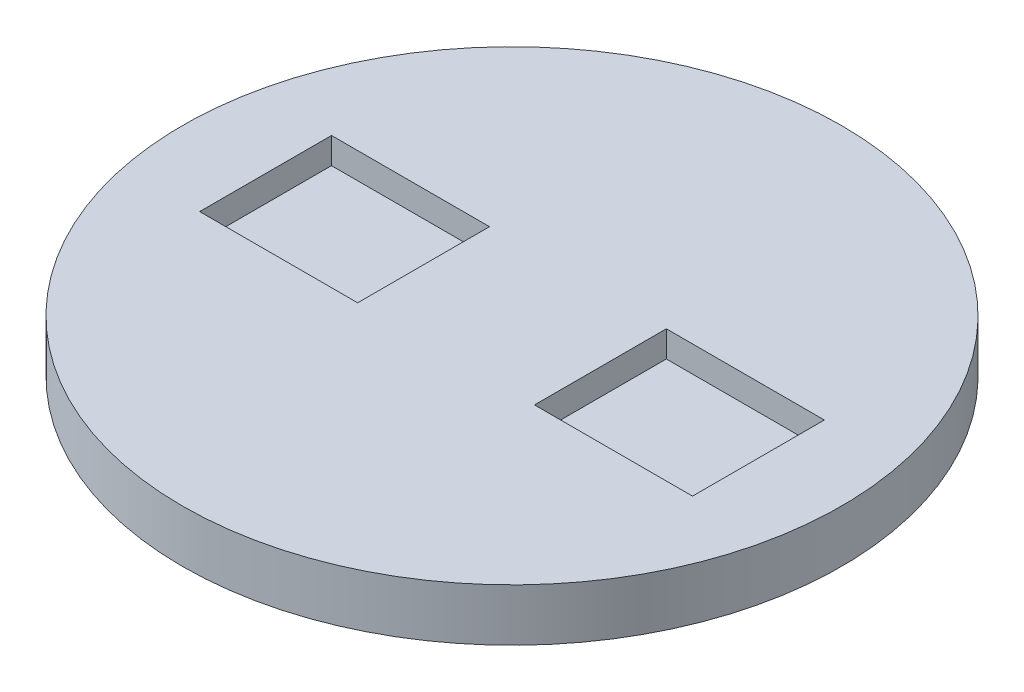
ISO-10303-21;
HEADER;
FILE_DESCRIPTION(('STEP AP214'),'2;1');
FILE_NAME('part.step','',(''),(''),'','','');
FILE_SCHEMA(('AUTOMOTIVE_DESIGN { 1 0 10303 214 1 1 1 1 }'));
ENDSEC;
DATA;
#1=APPLICATION_CONTEXT('core data for automotive mechanical design processes');
#2=APPLICATION_PROTOCOL_DEFINITION('international standard','automotive_design',2000,#1);
#3=PRODUCT_CONTEXT('',#1,'mechanical');
#4=PRODUCT('Part','Part','',(#3));
#5=PRODUCT_RELATED_PRODUCT_CATEGORY('part','',(#4));
#6=PRODUCT_DEFINITION_FORMATION('','',#4);
#7=PRODUCT_DEFINITION_CONTEXT('part definition',#1,'design');
#8=PRODUCT_DEFINITION('design','',#6,#7);
#9=PRODUCT_DEFINITION_SHAPE('','',#8);
#10=(LENGTH_UNIT() NAMED_UNIT(*) SI_UNIT(.MILLI.,.METRE.));
#11=(NAMED_UNIT(*) PLANE_ANGLE_UNIT() SI_UNIT($,.RADIAN.));
#12=(NAMED_UNIT(*) SI_UNIT($,.STERADIAN.) SOLID_ANGLE_UNIT());
#13=UNCERTAINTY_MEASURE_WITH_UNIT(LENGTH_MEASURE(1.E-05),#10,'distance_accuracy_value','');
#14=(GEOMETRIC_REPRESENTATION_CONTEXT(3) GLOBAL_UNCERTAINTY_ASSIGNED_CONTEXT((#13)) GLOBAL_UNIT_ASSIGNED_CONTEXT((#10,
#11,#12)) REPRESENTATION_CONTEXT('',''));
#15=CARTESIAN_POINT('',(0.,0.,0.));
#16=DIRECTION('',(0.,0.,1.));
#17=DIRECTION('',(1.,0.,0.));
#18=AXIS2_PLACEMENT_3D('',#15,#16,#17);
#19=CARTESIAN_POINT('',(0.,10.,0.));
#20=DIRECTION('',(0.,1.,0.));
#21=DIRECTION('',(0.,0.,1.));
#22=AXIS2_PLACEMENT_3D('',#19,#20,#21);
#23=PLANE('',#22);
#24=DIRECTION('',(1.,0.,0.));
#25=VECTOR('',#24,1.);
#26=CARTESIAN_POINT('',(0.,10.,-12.6));
#27=LINE('',#26,#25);
#28=CARTESIAN_POINT('',(-47.1,10.,-12.6));
#29=VERTEX_POINT('',#28);
#30=CARTESIAN_POINT('',(-16.9,10.,-12.6));
#31=VERTEX_POINT('',#30);
#32=EDGE_CURVE('E152',#29,#31,#27,.T.);
#33=ORIENTED_EDGE('',*,*,#32,.T.);
#34=DIRECTION('',(0.,0.,1.));
#35=VECTOR('',#34,1.);
#36=CARTESIAN_POINT('',(-16.9,10.,0.));
#37=LINE('',#36,#35);
#38=CARTESIAN_POINT('',(-16.9,10.,12.6));
#39=VERTEX_POINT('',#38);
#40=EDGE_CURVE('E58',#31,#39,#37,.T.);
#41=ORIENTED_EDGE('',*,*,#40,.T.);
#42=DIRECTION('',(1.,0.,0.));
#43=VECTOR('',#42,1.);
#44=CARTESIAN_POINT('',(0.,10.,12.6));
#45=LINE('',#44,#43);
#46=CARTESIAN_POINT('',(-47.1,10.,12.6));
#47=VERTEX_POINT('',#46);
#48=EDGE_CURVE('E142',#47,#39,#45,.T.);
#49=ORIENTED_EDGE('',*,*,#48,.F.);
#50=DIRECTION('',(0.,0.,1.));
#51=VECTOR('',#50,1.);
#52=CARTESIAN_POINT('',(-47.1,10.,0.));
#53=LINE('',#52,#51);
#54=EDGE_CURVE('E155',#29,#47,#53,.T.);
#55=ORIENTED_EDGE('',*,*,#54,.F.);
#56=EDGE_LOOP('',(#33,#41,#49,#55));
#57=FACE_BOUND('',#56,.T.);
#58=CARTESIAN_POINT('',(0.,10.,0.));
#59=DIRECTION('',(0.,1.,0.));
#60=DIRECTION('',(0.,0.,1.));
#61=AXIS2_PLACEMENT_3D('',#58,#59,#60);
#62=CIRCLE('',#61,62.9894227773488);
#63=CARTESIAN_POINT('',(0.,10.,62.9894227773488));
#64=VERTEX_POINT('',#63);
#65=EDGE_CURVE('E11',#64,#64,#62,.T.);
#66=ORIENTED_EDGE('',*,*,#65,.T.);
#67=EDGE_LOOP('',(#66));
#68=FACE_BOUND('',#67,.T.);
#69=DIRECTION('',(0.,0.,1.));
#70=VECTOR('',#69,1.);
#71=CARTESIAN_POINT('',(16.9,10.,0.));
#72=LINE('',#71,#70);
#73=CARTESIAN_POINT('',(16.9,10.,-12.6));
#74=VERTEX_POINT('',#73);
#75=CARTESIAN_POINT('',(16.9,10.,12.6));
#76=VERTEX_POINT('',#75);
#77=EDGE_CURVE('E127',#74,#76,#72,.T.);
#78=ORIENTED_EDGE('',*,*,#77,.F.);
#79=DIRECTION('',(1.,0.,0.));
#80=VECTOR('',#79,1.);
#81=CARTESIAN_POINT('',(0.,10.,-12.6));
#82=LINE('',#81,#80);
#83=CARTESIAN_POINT('',(47.1,10.,-12.6));
#84=VERTEX_POINT('',#83);
#85=EDGE_CURVE('E50',#74,#84,#82,.T.);
#86=ORIENTED_EDGE('',*,*,#85,.T.);
#87=DIRECTION('',(0.,0.,1.));
#88=VECTOR('',#87,1.);
#89=CARTESIAN_POINT('',(47.1,10.,0.));
#90=LINE('',#89,#88);
#91=CARTESIAN_POINT('',(47.1,10.,12.6));
#92=VERTEX_POINT('',#91);
#93=EDGE_CURVE('E117',#84,#92,#90,.T.);
#94=ORIENTED_EDGE('',*,*,#93,.T.);
#95=DIRECTION('',(1.,0.,0.));
#96=VECTOR('',#95,1.);
#97=CARTESIAN_POINT('',(0.,10.,12.6));
#98=LINE('',#97,#96);
#99=EDGE_CURVE('E129',#76,#92,#98,.T.);
#100=ORIENTED_EDGE('',*,*,#99,.F.);
#101=EDGE_LOOP('',(#78,#86,#94,#100));
#102=FACE_BOUND('',#101,.T.);
#103=ADVANCED_FACE('F35',(#57,#68,#102),#23,.T.);
#104=CARTESIAN_POINT('',(0.,10.,0.));
#105=DIRECTION('',(0.,-1.,0.));
#106=DIRECTION('',(0.,0.,-1.));
#107=AXIS2_PLACEMENT_3D('',#104,#105,#106);
#108=CYLINDRICAL_SURFACE('',#107,62.9894227773488);
#109=ORIENTED_EDGE('',*,*,#65,.F.);
#110=EDGE_LOOP('',(#109));
#111=FACE_BOUND('',#110,.T.);
#112=CARTESIAN_POINT('',(0.,0.,0.));
#113=DIRECTION('',(0.,1.,0.));
#114=DIRECTION('',(0.,0.,1.));
#115=AXIS2_PLACEMENT_3D('',#112,#113,#114);
#116=CIRCLE('',#115,62.9894227773488);
#117=CARTESIAN_POINT('',(0.,0.,62.9894227773488));
#118=VERTEX_POINT('',#117);
#119=EDGE_CURVE('E39',#118,#118,#116,.T.);
#120=ORIENTED_EDGE('',*,*,#119,.T.);
#121=EDGE_LOOP('',(#120));
#122=FACE_BOUND('',#121,.T.);
#123=ADVANCED_FACE('F37',(#111,#122),#108,.T.);
#124=CARTESIAN_POINT('',(0.,0.,0.));
#125=DIRECTION('',(0.,1.,0.));
#126=DIRECTION('',(0.,0.,1.));
#127=AXIS2_PLACEMENT_3D('',#124,#125,#126);
#128=PLANE('',#127);
#129=ORIENTED_EDGE('',*,*,#119,.F.);
#130=EDGE_LOOP('',(#129));
#131=FACE_BOUND('',#130,.T.);
#132=ADVANCED_FACE('F192',(#131),#128,.F.);
#133=CARTESIAN_POINT('',(-16.9,5.,0.));
#134=DIRECTION('',(-1.,0.,0.));
#135=DIRECTION('',(0.,0.,1.));
#136=AXIS2_PLACEMENT_3D('',#133,#134,#135);
#137=PLANE('',#136);
#138=ORIENTED_EDGE('',*,*,#40,.F.);
#139=DIRECTION('',(0.,1.,0.));
#140=VECTOR('',#139,1.);
#141=CARTESIAN_POINT('',(-16.9,5.,-12.6));
#142=LINE('',#141,#140);
#143=CARTESIAN_POINT('',(-16.9,5.,-12.6));
#144=VERTEX_POINT('',#143);
#145=EDGE_CURVE('E150',#144,#31,#142,.T.);
#146=ORIENTED_EDGE('',*,*,#145,.F.);
#147=DIRECTION('',(0.,0.,1.));
#148=VECTOR('',#147,1.);
#149=CARTESIAN_POINT('',(-16.9,5.,0.));
#150=LINE('',#149,#148);
#151=CARTESIAN_POINT('',(-16.9,5.,12.6));
#152=VERTEX_POINT('',#151);
#153=EDGE_CURVE('E139',#144,#152,#150,.T.);
#154=ORIENTED_EDGE('',*,*,#153,.T.);
#155=DIRECTION('',(0.,1.,0.));
#156=VECTOR('',#155,1.);
#157=CARTESIAN_POINT('',(-16.9,5.,12.6));
#158=LINE('',#157,#156);
#159=EDGE_CURVE('E160',#152,#39,#158,.T.);
#160=ORIENTED_EDGE('',*,*,#159,.T.);
#161=EDGE_LOOP('',(#138,#146,#154,#160));
#162=FACE_BOUND('',#161,.T.);
#163=ADVANCED_FACE('F182',(#162),#137,.T.);
#164=CARTESIAN_POINT('',(0.,5.,12.6));
#165=DIRECTION('',(0.,0.,1.));
#166=DIRECTION('',(1.,0.,0.));
#167=AXIS2_PLACEMENT_3D('',#164,#165,#166);
#168=PLANE('',#167);
#169=ORIENTED_EDGE('',*,*,#48,.T.);
#170=ORIENTED_EDGE('',*,*,#159,.F.);
#171=DIRECTION('',(1.,0.,0.));
#172=VECTOR('',#171,1.);
#173=CARTESIAN_POINT('',(0.,5.,12.6));
#174=LINE('',#173,#172);
#175=CARTESIAN_POINT('',(-47.1,5.,12.6));
#176=VERTEX_POINT('',#175);
#177=EDGE_CURVE('E147',#176,#152,#174,.T.);
#178=ORIENTED_EDGE('',*,*,#177,.F.);
#179=DIRECTION('',(0.,1.,0.));
#180=VECTOR('',#179,1.);
#181=CARTESIAN_POINT('',(-47.1,5.,12.6));
#182=LINE('',#181,#180);
#183=EDGE_CURVE('E162',#176,#47,#182,.T.);
#184=ORIENTED_EDGE('',*,*,#183,.T.);
#185=EDGE_LOOP('',(#169,#170,#178,#184));
#186=FACE_BOUND('',#185,.T.);
#187=ADVANCED_FACE('F184',(#186),#168,.F.);
#188=CARTESIAN_POINT('',(-47.1,5.,0.));
#189=DIRECTION('',(-1.,0.,0.));
#190=DIRECTION('',(0.,0.,1.));
#191=AXIS2_PLACEMENT_3D('',#188,#189,#190);
#192=PLANE('',#191);
#193=ORIENTED_EDGE('',*,*,#54,.T.);
#194=ORIENTED_EDGE('',*,*,#183,.F.);
#195=DIRECTION('',(0.,0.,1.));
#196=VECTOR('',#195,1.);
#197=CARTESIAN_POINT('',(-47.1,5.,0.));
#198=LINE('',#197,#196);
#199=CARTESIAN_POINT('',(-47.1,5.,-12.6));
#200=VERTEX_POINT('',#199);
#201=EDGE_CURVE('E144',#200,#176,#198,.T.);
#202=ORIENTED_EDGE('',*,*,#201,.F.);
#203=DIRECTION('',(0.,1.,0.));
#204=VECTOR('',#203,1.);
#205=CARTESIAN_POINT('',(-47.1,5.,-12.6));
#206=LINE('',#205,#204);
#207=EDGE_CURVE('E164',#200,#29,#206,.T.);
#208=ORIENTED_EDGE('',*,*,#207,.T.);
#209=EDGE_LOOP('',(#193,#194,#202,#208));
#210=FACE_BOUND('',#209,.T.);
#211=ADVANCED_FACE('F176',(#210),#192,.F.);
#212=CARTESIAN_POINT('',(0.,5.,-12.6));
#213=DIRECTION('',(0.,0.,1.));
#214=DIRECTION('',(1.,0.,0.));
#215=AXIS2_PLACEMENT_3D('',#212,#213,#214);
#216=PLANE('',#215);
#217=ORIENTED_EDGE('',*,*,#32,.F.);
#218=ORIENTED_EDGE('',*,*,#207,.F.);
#219=DIRECTION('',(1.,0.,0.));
#220=VECTOR('',#219,1.);
#221=CARTESIAN_POINT('',(0.,5.,-12.6));
#222=LINE('',#221,#220);
#223=EDGE_CURVE('E141',#200,#144,#222,.T.);
#224=ORIENTED_EDGE('',*,*,#223,.T.);
#225=ORIENTED_EDGE('',*,*,#145,.T.);
#226=EDGE_LOOP('',(#217,#218,#224,#225));
#227=FACE_BOUND('',#226,.T.);
#228=ADVANCED_FACE('F168',(#227),#216,.T.);
#229=CARTESIAN_POINT('',(0.,5.,0.));
#230=DIRECTION('',(0.,1.,0.));
#231=DIRECTION('',(0.,0.,1.));
#232=AXIS2_PLACEMENT_3D('',#229,#230,#231);
#233=PLANE('',#232);
#234=ORIENTED_EDGE('',*,*,#153,.F.);
#235=ORIENTED_EDGE('',*,*,#223,.F.);
#236=ORIENTED_EDGE('',*,*,#201,.T.);
#237=ORIENTED_EDGE('',*,*,#177,.T.);
#238=EDGE_LOOP('',(#234,#235,#236,#237));
#239=FACE_BOUND('',#238,.T.);
#240=ADVANCED_FACE('F179',(#239),#233,.T.);
#241=CARTESIAN_POINT('',(0.,5.,-12.6));
#242=DIRECTION('',(0.,0.,1.));
#243=DIRECTION('',(1.,0.,0.));
#244=AXIS2_PLACEMENT_3D('',#241,#242,#243);
#245=PLANE('',#244);
#246=ORIENTED_EDGE('',*,*,#85,.F.);
#247=DIRECTION('',(0.,1.,0.));
#248=VECTOR('',#247,1.);
#249=CARTESIAN_POINT('',(16.9,5.,-12.6));
#250=LINE('',#249,#248);
#251=CARTESIAN_POINT('',(16.9,5.,-12.6));
#252=VERTEX_POINT('',#251);
#253=EDGE_CURVE('E100',#252,#74,#250,.T.);
#254=ORIENTED_EDGE('',*,*,#253,.F.);
#255=DIRECTION('',(1.,0.,0.));
#256=VECTOR('',#255,1.);
#257=CARTESIAN_POINT('',(0.,5.,-12.6));
#258=LINE('',#257,#256);
#259=CARTESIAN_POINT('',(47.1,5.,-12.6));
#260=VERTEX_POINT('',#259);
#261=EDGE_CURVE('E103',#252,#260,#258,.T.);
#262=ORIENTED_EDGE('',*,*,#261,.T.);
#263=DIRECTION('',(0.,1.,0.));
#264=VECTOR('',#263,1.);
#265=CARTESIAN_POINT('',(47.1,5.,-12.6));
#266=LINE('',#265,#264);
#267=EDGE_CURVE('E134',#260,#84,#266,.T.);
#268=ORIENTED_EDGE('',*,*,#267,.T.);
#269=EDGE_LOOP('',(#246,#254,#262,#268));
#270=FACE_BOUND('',#269,.T.);
#271=ADVANCED_FACE('F102',(#270),#245,.T.);
#272=CARTESIAN_POINT('',(47.1,5.,0.));
#273=DIRECTION('',(-1.,0.,0.));
#274=DIRECTION('',(0.,0.,1.));
#275=AXIS2_PLACEMENT_3D('',#272,#273,#274);
#276=PLANE('',#275);
#277=ORIENTED_EDGE('',*,*,#93,.F.);
#278=ORIENTED_EDGE('',*,*,#267,.F.);
#279=DIRECTION('',(0.,0.,1.));
#280=VECTOR('',#279,1.);
#281=CARTESIAN_POINT('',(47.1,5.,0.));
#282=LINE('',#281,#280);
#283=CARTESIAN_POINT('',(47.1,5.,12.6));
#284=VERTEX_POINT('',#283);
#285=EDGE_CURVE('E110',#260,#284,#282,.T.);
#286=ORIENTED_EDGE('',*,*,#285,.T.);
#287=DIRECTION('',(0.,1.,0.));
#288=VECTOR('',#287,1.);
#289=CARTESIAN_POINT('',(47.1,5.,12.6));
#290=LINE('',#289,#288);
#291=EDGE_CURVE('E136',#284,#92,#290,.T.);
#292=ORIENTED_EDGE('',*,*,#291,.T.);
#293=EDGE_LOOP('',(#277,#278,#286,#292));
#294=FACE_BOUND('',#293,.T.);
#295=ADVANCED_FACE('F252',(#294),#276,.T.);
#296=CARTESIAN_POINT('',(0.,5.,12.6));
#297=DIRECTION('',(0.,0.,1.));
#298=DIRECTION('',(1.,0.,0.));
#299=AXIS2_PLACEMENT_3D('',#296,#297,#298);
#300=PLANE('',#299);
#301=ORIENTED_EDGE('',*,*,#99,.T.);
#302=ORIENTED_EDGE('',*,*,#291,.F.);
#303=DIRECTION('',(1.,0.,0.));
#304=VECTOR('',#303,1.);
#305=CARTESIAN_POINT('',(0.,5.,12.6));
#306=LINE('',#305,#304);
#307=CARTESIAN_POINT('',(16.9,5.,12.6));
#308=VERTEX_POINT('',#307);
#309=EDGE_CURVE('E121',#308,#284,#306,.T.);
#310=ORIENTED_EDGE('',*,*,#309,.F.);
#311=DIRECTION('',(0.,1.,0.));
#312=VECTOR('',#311,1.);
#313=CARTESIAN_POINT('',(16.9,5.,12.6));
#314=LINE('',#313,#312);
#315=EDGE_CURVE('E109',#308,#76,#314,.T.);
#316=ORIENTED_EDGE('',*,*,#315,.T.);
#317=EDGE_LOOP('',(#301,#302,#310,#316));
#318=FACE_BOUND('',#317,.T.);
#319=ADVANCED_FACE('F261',(#318),#300,.F.);
#320=CARTESIAN_POINT('',(16.9,5.,0.));
#321=DIRECTION('',(-1.,0.,0.));
#322=DIRECTION('',(0.,0.,1.));
#323=AXIS2_PLACEMENT_3D('',#320,#321,#322);
#324=PLANE('',#323);
#325=ORIENTED_EDGE('',*,*,#77,.T.);
#326=ORIENTED_EDGE('',*,*,#315,.F.);
#327=DIRECTION('',(0.,0.,1.));
#328=VECTOR('',#327,1.);
#329=CARTESIAN_POINT('',(16.9,5.,0.));
#330=LINE('',#329,#328);
#331=EDGE_CURVE('E116',#252,#308,#330,.T.);
#332=ORIENTED_EDGE('',*,*,#331,.F.);
#333=ORIENTED_EDGE('',*,*,#253,.T.);
#334=EDGE_LOOP('',(#325,#326,#332,#333));
#335=FACE_BOUND('',#334,.T.);
#336=ADVANCED_FACE('F119',(#335),#324,.F.);
#337=CARTESIAN_POINT('',(0.,5.,0.));
#338=DIRECTION('',(0.,1.,0.));
#339=DIRECTION('',(0.,0.,1.));
#340=AXIS2_PLACEMENT_3D('',#337,#338,#339);
#341=PLANE('',#340);
#342=ORIENTED_EDGE('',*,*,#261,.F.);
#343=ORIENTED_EDGE('',*,*,#331,.T.);
#344=ORIENTED_EDGE('',*,*,#309,.T.);
#345=ORIENTED_EDGE('',*,*,#285,.F.);
#346=EDGE_LOOP('',(#342,#343,#344,#345));
#347=FACE_BOUND('',#346,.T.);
#348=ADVANCED_FACE('F114',(#347),#341,.T.);
#349=CLOSED_SHELL('',(#103,#123,#132,#163,#187,#211,#228,#240,#271,#295,#319,#336,#348));
#350=MANIFOLD_SOLID_BREP('B2',#349);
#351=ADVANCED_BREP_SHAPE_REPRESENTATION('',(#18,#350),#14);
#352=SHAPE_DEFINITION_REPRESENTATION(#9,#351);
ENDSEC;
END-ISO-10303-21;
